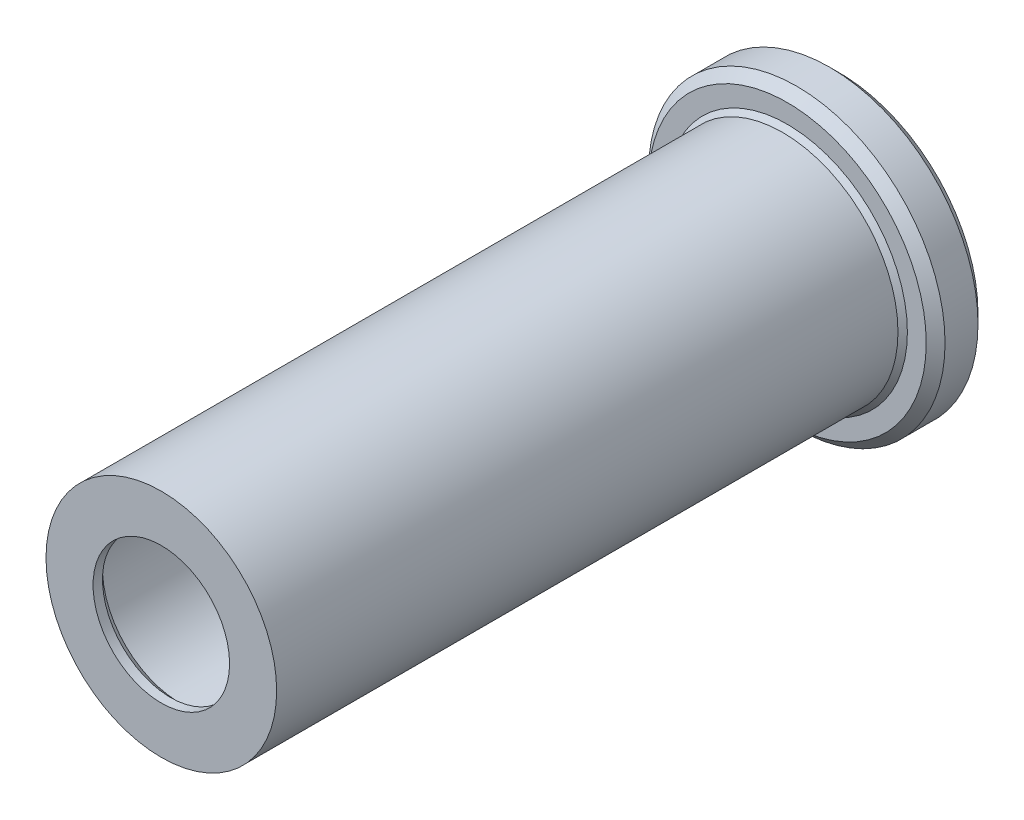
ISO-10303-21;
HEADER;
FILE_DESCRIPTION(('STEP AP214'),'2;1');
FILE_NAME('part.step','',(''),(''),'','','');
FILE_SCHEMA(('AUTOMOTIVE_DESIGN { 1 0 10303 214 1 1 1 1 }'));
ENDSEC;
DATA;
#1=APPLICATION_CONTEXT('core data for automotive mechanical design processes');
#2=APPLICATION_PROTOCOL_DEFINITION('international standard','automotive_design',2000,#1);
#3=PRODUCT_CONTEXT('',#1,'mechanical');
#4=PRODUCT('Part','Part','',(#3));
#5=PRODUCT_RELATED_PRODUCT_CATEGORY('part','',(#4));
#6=PRODUCT_DEFINITION_FORMATION('','',#4);
#7=PRODUCT_DEFINITION_CONTEXT('part definition',#1,'design');
#8=PRODUCT_DEFINITION('design','',#6,#7);
#9=PRODUCT_DEFINITION_SHAPE('','',#8);
#10=(LENGTH_UNIT() NAMED_UNIT(*) SI_UNIT(.MILLI.,.METRE.));
#11=(NAMED_UNIT(*) PLANE_ANGLE_UNIT() SI_UNIT($,.RADIAN.));
#12=(NAMED_UNIT(*) SI_UNIT($,.STERADIAN.) SOLID_ANGLE_UNIT());
#13=UNCERTAINTY_MEASURE_WITH_UNIT(LENGTH_MEASURE(1.E-05),#10,'distance_accuracy_value','');
#14=(GEOMETRIC_REPRESENTATION_CONTEXT(3) GLOBAL_UNCERTAINTY_ASSIGNED_CONTEXT((#13)) GLOBAL_UNIT_ASSIGNED_CONTEXT((#10,
#11,#12)) REPRESENTATION_CONTEXT('',''));
#15=CARTESIAN_POINT('',(0.,0.,0.));
#16=DIRECTION('',(0.,0.,1.));
#17=DIRECTION('',(1.,0.,0.));
#18=AXIS2_PLACEMENT_3D('',#15,#16,#17);
#19=CARTESIAN_POINT('',(0.,0.,0.));
#20=DIRECTION('',(0.,0.,1.));
#21=DIRECTION('',(1.,0.,0.));
#22=AXIS2_PLACEMENT_3D('',#19,#20,#21);
#23=PLANE('',#22);
#24=CARTESIAN_POINT('',(0.,0.,0.));
#25=DIRECTION('',(0.,0.,1.));
#26=DIRECTION('',(1.,0.,0.));
#27=AXIS2_PLACEMENT_3D('',#24,#25,#26);
#28=CIRCLE('',#27,11.25);
#29=CARTESIAN_POINT('',(11.25,0.,0.));
#30=VERTEX_POINT('',#29);
#31=EDGE_CURVE('E118',#30,#30,#28,.T.);
#32=ORIENTED_EDGE('',*,*,#31,.T.);
#33=EDGE_LOOP('',(#32));
#34=FACE_BOUND('',#33,.T.);
#35=CARTESIAN_POINT('',(0.,0.,0.));
#36=DIRECTION('',(0.,0.,1.));
#37=DIRECTION('',(1.,0.,0.));
#38=AXIS2_PLACEMENT_3D('',#35,#36,#37);
#39=CIRCLE('',#38,14.75);
#40=CARTESIAN_POINT('',(14.75,0.,0.));
#41=VERTEX_POINT('',#40);
#42=EDGE_CURVE('E122',#41,#41,#39,.F.);
#43=ORIENTED_EDGE('',*,*,#42,.T.);
#44=EDGE_LOOP('',(#43));
#45=FACE_BOUND('',#44,.T.);
#46=ADVANCED_FACE('F77',(#34,#45),#23,.F.);
#47=CARTESIAN_POINT('',(0.,0.,70.));
#48=DIRECTION('',(0.,0.,-1.));
#49=DIRECTION('',(-1.,0.,0.));
#50=AXIS2_PLACEMENT_3D('',#47,#48,#49);
#51=CYLINDRICAL_SURFACE('',#50,12.25);
#52=CARTESIAN_POINT('',(0.,0.,6.00000000000001));
#53=DIRECTION('',(0.,0.,1.));
#54=DIRECTION('',(1.,0.,0.));
#55=AXIS2_PLACEMENT_3D('',#52,#53,#54);
#56=CIRCLE('',#55,12.25);
#57=CARTESIAN_POINT('',(12.25,0.,6.00000000000001));
#58=VERTEX_POINT('',#57);
#59=EDGE_CURVE('E110',#58,#58,#56,.T.);
#60=ORIENTED_EDGE('',*,*,#59,.T.);
#61=EDGE_LOOP('',(#60));
#62=FACE_BOUND('',#61,.T.);
#63=CARTESIAN_POINT('',(0.,0.,72.));
#64=DIRECTION('',(0.,0.,1.));
#65=DIRECTION('',(1.,0.,0.));
#66=AXIS2_PLACEMENT_3D('',#63,#64,#65);
#67=CIRCLE('',#66,12.25);
#68=CARTESIAN_POINT('',(12.25,0.,72.));
#69=VERTEX_POINT('',#68);
#70=EDGE_CURVE('E130',#69,#69,#67,.T.);
#71=ORIENTED_EDGE('',*,*,#70,.F.);
#72=EDGE_LOOP('',(#71));
#73=FACE_BOUND('',#72,.T.);
#74=ADVANCED_FACE('F155',(#62,#73),#51,.T.);
#75=CARTESIAN_POINT('',(0.,0.,70.));
#76=DIRECTION('',(0.,0.,-1.));
#77=DIRECTION('',(-1.,0.,0.));
#78=AXIS2_PLACEMENT_3D('',#75,#76,#77);
#79=CYLINDRICAL_SURFACE('',#78,9.25);
#80=CARTESIAN_POINT('',(0.,0.,2.));
#81=DIRECTION('',(0.,0.,1.));
#82=DIRECTION('',(1.,0.,0.));
#83=AXIS2_PLACEMENT_3D('',#80,#81,#82);
#84=CIRCLE('',#83,9.25);
#85=CARTESIAN_POINT('',(9.25,0.,2.));
#86=VERTEX_POINT('',#85);
#87=EDGE_CURVE('E114',#86,#86,#84,.F.);
#88=ORIENTED_EDGE('',*,*,#87,.T.);
#89=EDGE_LOOP('',(#88));
#90=FACE_BOUND('',#89,.T.);
#91=CARTESIAN_POINT('',(0.,0.,70.));
#92=DIRECTION('',(0.,0.,1.));
#93=DIRECTION('',(1.,0.,0.));
#94=AXIS2_PLACEMENT_3D('',#91,#92,#93);
#95=CIRCLE('',#94,9.25);
#96=CARTESIAN_POINT('',(9.25,0.,70.));
#97=VERTEX_POINT('',#96);
#98=EDGE_CURVE('E126',#97,#97,#95,.T.);
#99=ORIENTED_EDGE('',*,*,#98,.T.);
#100=EDGE_LOOP('',(#99));
#101=FACE_BOUND('',#100,.T.);
#102=ADVANCED_FACE('F161',(#90,#101),#79,.F.);
#103=CARTESIAN_POINT('',(0.,0.,5.5));
#104=DIRECTION('',(0.,0.,1.));
#105=DIRECTION('',(1.,0.,0.));
#106=AXIS2_PLACEMENT_3D('',#103,#104,#105);
#107=PLANE('',#106);
#108=CARTESIAN_POINT('',(0.,0.,5.5));
#109=DIRECTION('',(0.,0.,1.));
#110=DIRECTION('',(1.,0.,0.));
#111=AXIS2_PLACEMENT_3D('',#108,#109,#110);
#112=CIRCLE('',#111,12.75);
#113=CARTESIAN_POINT('',(12.75,0.,5.5));
#114=VERTEX_POINT('',#113);
#115=EDGE_CURVE('E102',#114,#114,#112,.F.);
#116=ORIENTED_EDGE('',*,*,#115,.T.);
#117=EDGE_LOOP('',(#116));
#118=FACE_BOUND('',#117,.T.);
#119=CARTESIAN_POINT('',(0.,0.,5.5));
#120=DIRECTION('',(0.,0.,1.));
#121=DIRECTION('',(1.,0.,0.));
#122=AXIS2_PLACEMENT_3D('',#119,#120,#121);
#123=CIRCLE('',#122,14.75);
#124=CARTESIAN_POINT('',(14.75,0.,5.5));
#125=VERTEX_POINT('',#124);
#126=EDGE_CURVE('E106',#125,#125,#123,.T.);
#127=ORIENTED_EDGE('',*,*,#126,.T.);
#128=EDGE_LOOP('',(#127));
#129=FACE_BOUND('',#128,.T.);
#130=ADVANCED_FACE('F201',(#118,#129),#107,.T.);
#131=CARTESIAN_POINT('',(0.,0.,5.5));
#132=DIRECTION('',(0.,0.,-1.));
#133=DIRECTION('',(-1.,0.,0.));
#134=AXIS2_PLACEMENT_3D('',#131,#132,#133);
#135=CYLINDRICAL_SURFACE('',#134,15.75);
#136=CARTESIAN_POINT('',(0.,0.,1.));
#137=DIRECTION('',(0.,0.,1.));
#138=DIRECTION('',(1.,0.,0.));
#139=AXIS2_PLACEMENT_3D('',#136,#137,#138);
#140=CIRCLE('',#139,15.75);
#141=CARTESIAN_POINT('',(15.75,0.,1.));
#142=VERTEX_POINT('',#141);
#143=EDGE_CURVE('E91',#142,#142,#140,.T.);
#144=ORIENTED_EDGE('',*,*,#143,.T.);
#145=EDGE_LOOP('',(#144));
#146=FACE_BOUND('',#145,.T.);
#147=CARTESIAN_POINT('',(0.,0.,4.5));
#148=DIRECTION('',(0.,0.,1.));
#149=DIRECTION('',(1.,0.,0.));
#150=AXIS2_PLACEMENT_3D('',#147,#148,#149);
#151=CIRCLE('',#150,15.75);
#152=CARTESIAN_POINT('',(15.75,0.,4.5));
#153=VERTEX_POINT('',#152);
#154=EDGE_CURVE('E96',#153,#153,#151,.F.);
#155=ORIENTED_EDGE('',*,*,#154,.T.);
#156=EDGE_LOOP('',(#155));
#157=FACE_BOUND('',#156,.T.);
#158=ADVANCED_FACE('F153',(#146,#157),#135,.T.);
#159=CARTESIAN_POINT('',(0.,0.,70.));
#160=DIRECTION('',(0.,0.,1.));
#161=DIRECTION('',(1.,0.,0.));
#162=AXIS2_PLACEMENT_3D('',#159,#160,#161);
#163=PLANE('',#162);
#164=CARTESIAN_POINT('',(0.,0.,70.));
#165=DIRECTION('',(0.,0.,1.));
#166=DIRECTION('',(1.,0.,0.));
#167=AXIS2_PLACEMENT_3D('',#164,#165,#166);
#168=CIRCLE('',#167,8.25);
#169=CARTESIAN_POINT('',(8.25,0.,70.));
#170=VERTEX_POINT('',#169);
#171=EDGE_CURVE('E86',#170,#170,#168,.T.);
#172=ORIENTED_EDGE('',*,*,#171,.T.);
#173=EDGE_LOOP('',(#172));
#174=FACE_BOUND('',#173,.T.);
#175=ORIENTED_EDGE('',*,*,#98,.F.);
#176=EDGE_LOOP('',(#175));
#177=FACE_BOUND('',#176,.T.);
#178=ADVANCED_FACE('F143',(#174,#177),#163,.F.);
#179=CARTESIAN_POINT('',(0.,0.,72.));
#180=DIRECTION('',(0.,0.,1.));
#181=DIRECTION('',(1.,0.,0.));
#182=AXIS2_PLACEMENT_3D('',#179,#180,#181);
#183=PLANE('',#182);
#184=ORIENTED_EDGE('',*,*,#70,.T.);
#185=EDGE_LOOP('',(#184));
#186=FACE_BOUND('',#185,.T.);
#187=CARTESIAN_POINT('',(0.,0.,72.));
#188=DIRECTION('',(0.,0.,1.));
#189=DIRECTION('',(1.,0.,0.));
#190=AXIS2_PLACEMENT_3D('',#187,#188,#189);
#191=CIRCLE('',#190,7.25);
#192=CARTESIAN_POINT('',(7.25,0.,72.));
#193=VERTEX_POINT('',#192);
#194=EDGE_CURVE('E134',#193,#193,#191,.T.);
#195=ORIENTED_EDGE('',*,*,#194,.F.);
#196=EDGE_LOOP('',(#195));
#197=FACE_BOUND('',#196,.T.);
#198=ADVANCED_FACE('F141',(#186,#197),#183,.T.);
#199=CARTESIAN_POINT('',(0.,0.,72.));
#200=DIRECTION('',(0.,0.,-1.));
#201=DIRECTION('',(-1.,0.,0.));
#202=AXIS2_PLACEMENT_3D('',#199,#200,#201);
#203=CYLINDRICAL_SURFACE('',#202,7.25);
#204=CARTESIAN_POINT('',(0.,0.,71.));
#205=DIRECTION('',(0.,0.,1.));
#206=DIRECTION('',(1.,0.,0.));
#207=AXIS2_PLACEMENT_3D('',#204,#205,#206);
#208=CIRCLE('',#207,7.25);
#209=CARTESIAN_POINT('',(7.25,0.,71.));
#210=VERTEX_POINT('',#209);
#211=EDGE_CURVE('E12',#210,#210,#208,.F.);
#212=ORIENTED_EDGE('',*,*,#211,.T.);
#213=EDGE_LOOP('',(#212));
#214=FACE_BOUND('',#213,.T.);
#215=ORIENTED_EDGE('',*,*,#194,.T.);
#216=EDGE_LOOP('',(#215));
#217=FACE_BOUND('',#216,.T.);
#218=ADVANCED_FACE('F139',(#214,#217),#203,.F.);
#219=CARTESIAN_POINT('',(0.,0.,0.));
#220=DIRECTION('',(0.,0.,-1.));
#221=DIRECTION('',(-1.,0.,0.));
#222=AXIS2_PLACEMENT_3D('',#219,#220,#221);
#223=CONICAL_SURFACE('',#222,11.25,0.785398163397448);
#224=ORIENTED_EDGE('',*,*,#87,.F.);
#225=EDGE_LOOP('',(#224));
#226=FACE_BOUND('',#225,.T.);
#227=ORIENTED_EDGE('',*,*,#31,.F.);
#228=EDGE_LOOP('',(#227));
#229=FACE_BOUND('',#228,.T.);
#230=ADVANCED_FACE('F150',(#226,#229),#223,.F.);
#231=CARTESIAN_POINT('',(0.,0.,6.00000000000001));
#232=DIRECTION('',(0.,0.,-1.));
#233=DIRECTION('',(-1.,0.,0.));
#234=AXIS2_PLACEMENT_3D('',#231,#232,#233);
#235=CONICAL_SURFACE('',#234,12.25,0.785398163397448);
#236=ORIENTED_EDGE('',*,*,#115,.F.);
#237=EDGE_LOOP('',(#236));
#238=FACE_BOUND('',#237,.T.);
#239=ORIENTED_EDGE('',*,*,#59,.F.);
#240=EDGE_LOOP('',(#239));
#241=FACE_BOUND('',#240,.T.);
#242=ADVANCED_FACE('F174',(#238,#241),#235,.T.);
#243=CARTESIAN_POINT('',(0.,0.,1.));
#244=DIRECTION('',(0.,0.,1.));
#245=DIRECTION('',(1.,0.,0.));
#246=AXIS2_PLACEMENT_3D('',#243,#244,#245);
#247=CONICAL_SURFACE('',#246,15.75,0.785398163397449);
#248=ORIENTED_EDGE('',*,*,#42,.F.);
#249=EDGE_LOOP('',(#248));
#250=FACE_BOUND('',#249,.T.);
#251=ORIENTED_EDGE('',*,*,#143,.F.);
#252=EDGE_LOOP('',(#251));
#253=FACE_BOUND('',#252,.T.);
#254=ADVANCED_FACE('F181',(#250,#253),#247,.T.);
#255=CARTESIAN_POINT('',(0.,0.,5.5));
#256=DIRECTION('',(0.,0.,-1.));
#257=DIRECTION('',(-1.,0.,0.));
#258=AXIS2_PLACEMENT_3D('',#255,#256,#257);
#259=CONICAL_SURFACE('',#258,14.75,0.785398163397449);
#260=ORIENTED_EDGE('',*,*,#154,.F.);
#261=EDGE_LOOP('',(#260));
#262=FACE_BOUND('',#261,.T.);
#263=ORIENTED_EDGE('',*,*,#126,.F.);
#264=EDGE_LOOP('',(#263));
#265=FACE_BOUND('',#264,.T.);
#266=ADVANCED_FACE('F187',(#262,#265),#259,.T.);
#267=CARTESIAN_POINT('',(0.,0.,70.));
#268=DIRECTION('',(0.,0.,-1.));
#269=DIRECTION('',(-1.,0.,0.));
#270=AXIS2_PLACEMENT_3D('',#267,#268,#269);
#271=CONICAL_SURFACE('',#270,8.25,0.785398163397448);
#272=ORIENTED_EDGE('',*,*,#211,.F.);
#273=EDGE_LOOP('',(#272));
#274=FACE_BOUND('',#273,.T.);
#275=ORIENTED_EDGE('',*,*,#171,.F.);
#276=EDGE_LOOP('',(#275));
#277=FACE_BOUND('',#276,.T.);
#278=ADVANCED_FACE('F80',(#274,#277),#271,.F.);
#279=CLOSED_SHELL('',(#46,#74,#102,#130,#158,#178,#198,#218,#230,#242,#254,#266,#278));
#280=MANIFOLD_SOLID_BREP('B2',#279);
#281=ADVANCED_BREP_SHAPE_REPRESENTATION('',(#18,#280),#14);
#282=SHAPE_DEFINITION_REPRESENTATION(#9,#281);
ENDSEC;
END-ISO-10303-21;
